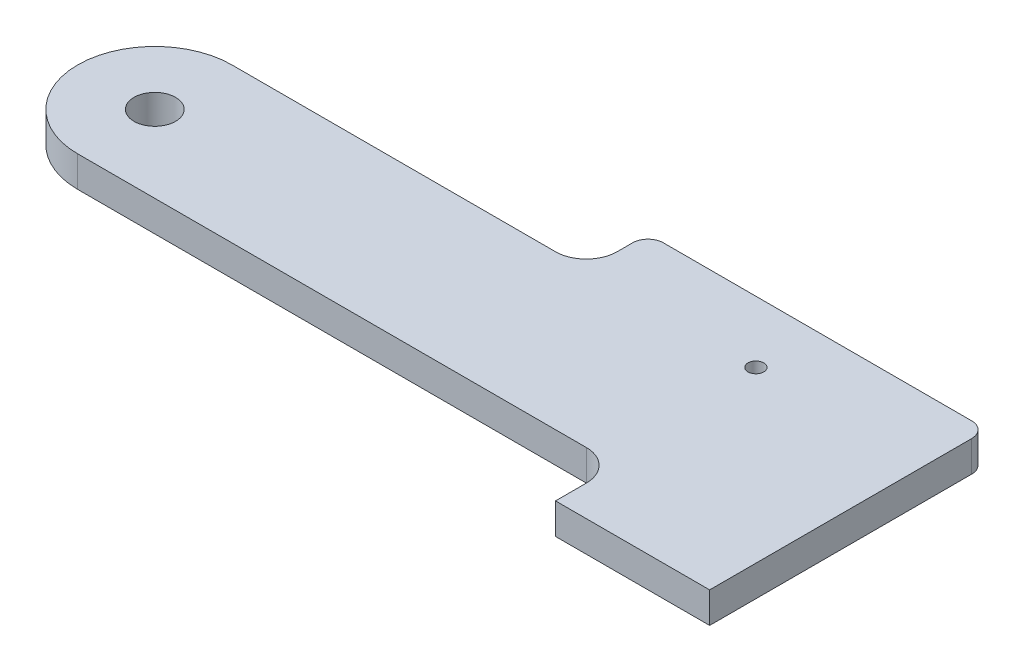
ISO-10303-21;
HEADER;
FILE_DESCRIPTION(('STEP AP214'),'2;1');
FILE_NAME('part.step','',(''),(''),'','','');
FILE_SCHEMA(('AUTOMOTIVE_DESIGN { 1 0 10303 214 1 1 1 1 }'));
ENDSEC;
DATA;
#1=APPLICATION_CONTEXT('core data for automotive mechanical design processes');
#2=APPLICATION_PROTOCOL_DEFINITION('international standard','automotive_design',2000,#1);
#3=PRODUCT_CONTEXT('',#1,'mechanical');
#4=PRODUCT('Part','Part','',(#3));
#5=PRODUCT_RELATED_PRODUCT_CATEGORY('part','',(#4));
#6=PRODUCT_DEFINITION_FORMATION('','',#4);
#7=PRODUCT_DEFINITION_CONTEXT('part definition',#1,'design');
#8=PRODUCT_DEFINITION('design','',#6,#7);
#9=PRODUCT_DEFINITION_SHAPE('','',#8);
#10=(LENGTH_UNIT() NAMED_UNIT(*) SI_UNIT(.MILLI.,.METRE.));
#11=(NAMED_UNIT(*) PLANE_ANGLE_UNIT() SI_UNIT($,.RADIAN.));
#12=(NAMED_UNIT(*) SI_UNIT($,.STERADIAN.) SOLID_ANGLE_UNIT());
#13=UNCERTAINTY_MEASURE_WITH_UNIT(LENGTH_MEASURE(1.E-05),#10,'distance_accuracy_value','');
#14=(GEOMETRIC_REPRESENTATION_CONTEXT(3) GLOBAL_UNCERTAINTY_ASSIGNED_CONTEXT((#13)) GLOBAL_UNIT_ASSIGNED_CONTEXT((#10,
#11,#12)) REPRESENTATION_CONTEXT('',''));
#15=CARTESIAN_POINT('',(0.,0.,0.));
#16=DIRECTION('',(0.,0.,1.));
#17=DIRECTION('',(1.,0.,0.));
#18=AXIS2_PLACEMENT_3D('',#15,#16,#17);
#19=CARTESIAN_POINT('',(-125.,10.,25.));
#20=DIRECTION('',(0.,0.,-1.));
#21=DIRECTION('',(-1.,0.,0.));
#22=AXIS2_PLACEMENT_3D('',#19,#20,#21);
#23=PLANE('',#22);
#24=DIRECTION('',(1.,0.,0.));
#25=VECTOR('',#24,1.);
#26=CARTESIAN_POINT('',(-125.,0.,25.));
#27=LINE('',#26,#25);
#28=CARTESIAN_POINT('',(-99.9999999999999,0.,25.));
#29=VERTEX_POINT('',#28);
#30=CARTESIAN_POINT('',(65.0000000000001,0.,25.));
#31=VERTEX_POINT('',#30);
#32=EDGE_CURVE('E132',#29,#31,#27,.T.);
#33=ORIENTED_EDGE('',*,*,#32,.T.);
#34=DIRECTION('',(0.,-1.,0.));
#35=VECTOR('',#34,1.);
#36=CARTESIAN_POINT('',(65.0000000000001,9.99999999999999,25.));
#37=LINE('',#36,#35);
#38=CARTESIAN_POINT('',(65.0000000000001,10.,25.));
#39=VERTEX_POINT('',#38);
#40=EDGE_CURVE('E207',#31,#39,#37,.F.);
#41=ORIENTED_EDGE('',*,*,#40,.T.);
#42=DIRECTION('',(1.,0.,0.));
#43=VECTOR('',#42,1.);
#44=CARTESIAN_POINT('',(-125.,10.,25.));
#45=LINE('',#44,#43);
#46=CARTESIAN_POINT('',(-99.9999999999999,10.,25.));
#47=VERTEX_POINT('',#46);
#48=EDGE_CURVE('E178',#47,#39,#45,.T.);
#49=ORIENTED_EDGE('',*,*,#48,.F.);
#50=DIRECTION('',(0.,-1.,0.));
#51=VECTOR('',#50,1.);
#52=CARTESIAN_POINT('',(-99.9999999999999,10.,25.));
#53=LINE('',#52,#51);
#54=EDGE_CURVE('E181',#47,#29,#53,.T.);
#55=ORIENTED_EDGE('',*,*,#54,.T.);
#56=EDGE_LOOP('',(#33,#41,#49,#55));
#57=FACE_BOUND('',#56,.T.);
#58=ADVANCED_FACE('F32',(#57),#23,.F.);
#59=CARTESIAN_POINT('',(-125.,10.,-25.));
#60=DIRECTION('',(0.,0.,1.));
#61=DIRECTION('',(1.,0.,0.));
#62=AXIS2_PLACEMENT_3D('',#59,#60,#61);
#63=PLANE('',#62);
#64=DIRECTION('',(-1.,0.,0.));
#65=VECTOR('',#64,1.);
#66=CARTESIAN_POINT('',(-125.,10.,-25.));
#67=LINE('',#66,#65);
#68=CARTESIAN_POINT('',(5.00000000000009,10.,-25.));
#69=VERTEX_POINT('',#68);
#70=CARTESIAN_POINT('',(-99.9999999999999,10.,-25.));
#71=VERTEX_POINT('',#70);
#72=EDGE_CURVE('E131',#69,#71,#67,.T.);
#73=ORIENTED_EDGE('',*,*,#72,.F.);
#74=DIRECTION('',(0.,1.,0.));
#75=VECTOR('',#74,1.);
#76=CARTESIAN_POINT('',(5.00000000000008,0.,-25.));
#77=LINE('',#76,#75);
#78=CARTESIAN_POINT('',(5.00000000000009,0.,-25.));
#79=VERTEX_POINT('',#78);
#80=EDGE_CURVE('E212',#69,#79,#77,.F.);
#81=ORIENTED_EDGE('',*,*,#80,.T.);
#82=DIRECTION('',(-1.,0.,0.));
#83=VECTOR('',#82,1.);
#84=CARTESIAN_POINT('',(-125.,0.,-25.));
#85=LINE('',#84,#83);
#86=CARTESIAN_POINT('',(-99.9999999999999,0.,-25.));
#87=VERTEX_POINT('',#86);
#88=EDGE_CURVE('E184',#79,#87,#85,.T.);
#89=ORIENTED_EDGE('',*,*,#88,.T.);
#90=DIRECTION('',(0.,-1.,0.));
#91=VECTOR('',#90,1.);
#92=CARTESIAN_POINT('',(-99.9999999999999,10.,-25.));
#93=LINE('',#92,#91);
#94=EDGE_CURVE('E199',#87,#71,#93,.F.);
#95=ORIENTED_EDGE('',*,*,#94,.T.);
#96=EDGE_LOOP('',(#73,#81,#89,#95));
#97=FACE_BOUND('',#96,.T.);
#98=ADVANCED_FACE('F258',(#97),#63,.F.);
#99=CARTESIAN_POINT('',(125.,10.,25.));
#100=DIRECTION('',(-1.,0.,0.));
#101=DIRECTION('',(0.,0.,1.));
#102=AXIS2_PLACEMENT_3D('',#99,#100,#101);
#103=PLANE('',#102);
#104=DIRECTION('',(0.,0.,-1.));
#105=VECTOR('',#104,1.);
#106=CARTESIAN_POINT('',(125.,0.,25.));
#107=LINE('',#106,#105);
#108=CARTESIAN_POINT('',(125.,0.,45.));
#109=VERTEX_POINT('',#108);
#110=CARTESIAN_POINT('',(125.,0.,-40.));
#111=VERTEX_POINT('',#110);
#112=EDGE_CURVE('E182',#109,#111,#107,.T.);
#113=ORIENTED_EDGE('',*,*,#112,.T.);
#114=DIRECTION('',(0.,-1.,0.));
#115=VECTOR('',#114,1.);
#116=CARTESIAN_POINT('',(125.,10.,-40.));
#117=LINE('',#116,#115);
#118=CARTESIAN_POINT('',(125.,10.,-40.));
#119=VERTEX_POINT('',#118);
#120=EDGE_CURVE('E55',#111,#119,#117,.F.);
#121=ORIENTED_EDGE('',*,*,#120,.T.);
#122=DIRECTION('',(0.,0.,-1.));
#123=VECTOR('',#122,1.);
#124=CARTESIAN_POINT('',(125.,10.,25.));
#125=LINE('',#124,#123);
#126=CARTESIAN_POINT('',(125.,10.,45.));
#127=VERTEX_POINT('',#126);
#128=EDGE_CURVE('E125',#127,#119,#125,.T.);
#129=ORIENTED_EDGE('',*,*,#128,.F.);
#130=DIRECTION('',(0.,1.,0.));
#131=VECTOR('',#130,1.);
#132=CARTESIAN_POINT('',(125.,0.,45.));
#133=LINE('',#132,#131);
#134=EDGE_CURVE('E129',#109,#127,#133,.T.);
#135=ORIENTED_EDGE('',*,*,#134,.F.);
#136=EDGE_LOOP('',(#113,#121,#129,#135));
#137=FACE_BOUND('',#136,.T.);
#138=ADVANCED_FACE('F127',(#137),#103,.F.);
#139=CARTESIAN_POINT('',(0.,10.,0.));
#140=DIRECTION('',(0.,-1.,0.));
#141=DIRECTION('',(0.,0.,-1.));
#142=AXIS2_PLACEMENT_3D('',#139,#140,#141);
#143=PLANE('',#142);
#144=CARTESIAN_POINT('',(70.0000000000001,10.,-25.));
#145=DIRECTION('',(0.,-1.,0.));
#146=DIRECTION('',(0.,0.,-1.));
#147=AXIS2_PLACEMENT_3D('',#144,#145,#146);
#148=CIRCLE('',#147,2.5527);
#149=CARTESIAN_POINT('',(70.0000000000001,10.,-27.5527));
#150=VERTEX_POINT('',#149);
#151=EDGE_CURVE('E147',#150,#150,#148,.T.);
#152=ORIENTED_EDGE('',*,*,#151,.T.);
#153=EDGE_LOOP('',(#152));
#154=FACE_BOUND('',#153,.T.);
#155=CARTESIAN_POINT('',(-99.9999999999999,10.,0.));
#156=DIRECTION('',(0.,1.,0.));
#157=DIRECTION('',(0.,0.,1.));
#158=AXIS2_PLACEMENT_3D('',#155,#156,#157);
#159=CIRCLE('',#158,6.75);
#160=CARTESIAN_POINT('',(-99.9999999999999,10.,6.75000000000002));
#161=VERTEX_POINT('',#160);
#162=EDGE_CURVE('E170',#161,#161,#159,.T.);
#163=ORIENTED_EDGE('',*,*,#162,.F.);
#164=EDGE_LOOP('',(#163));
#165=FACE_BOUND('',#164,.T.);
#166=ORIENTED_EDGE('',*,*,#128,.T.);
#167=CARTESIAN_POINT('',(120.,10.,-40.));
#168=DIRECTION('',(0.,-1.,0.));
#169=DIRECTION('',(0.,0.,-1.));
#170=AXIS2_PLACEMENT_3D('',#167,#168,#169);
#171=CIRCLE('',#170,5.);
#172=CARTESIAN_POINT('',(120.,10.,-45.));
#173=VERTEX_POINT('',#172);
#174=EDGE_CURVE('E40',#119,#173,#171,.F.);
#175=ORIENTED_EDGE('',*,*,#174,.T.);
#176=DIRECTION('',(1.,0.,0.));
#177=VECTOR('',#176,1.);
#178=CARTESIAN_POINT('',(125.,10.,-45.));
#179=LINE('',#178,#177);
#180=CARTESIAN_POINT('',(20.0000000000001,10.,-45.));
#181=VERTEX_POINT('',#180);
#182=EDGE_CURVE('E163',#181,#173,#179,.T.);
#183=ORIENTED_EDGE('',*,*,#182,.F.);
#184=CARTESIAN_POINT('',(20.0000000000001,10.,-40.));
#185=DIRECTION('',(0.,-1.,0.));
#186=DIRECTION('',(0.,0.,-1.));
#187=AXIS2_PLACEMENT_3D('',#184,#185,#186);
#188=CIRCLE('',#187,5.);
#189=CARTESIAN_POINT('',(15.0000000000001,10.,-40.));
#190=VERTEX_POINT('',#189);
#191=EDGE_CURVE('E47',#181,#190,#188,.F.);
#192=ORIENTED_EDGE('',*,*,#191,.T.);
#193=DIRECTION('',(0.,0.,1.));
#194=VECTOR('',#193,1.);
#195=CARTESIAN_POINT('',(15.0000000000001,10.,-45.));
#196=LINE('',#195,#194);
#197=CARTESIAN_POINT('',(15.0000000000001,10.,-35.));
#198=VERTEX_POINT('',#197);
#199=EDGE_CURVE('E166',#190,#198,#196,.T.);
#200=ORIENTED_EDGE('',*,*,#199,.T.);
#201=CARTESIAN_POINT('',(5.00000000000008,10.,-35.));
#202=DIRECTION('',(0.,-1.,0.));
#203=DIRECTION('',(0.,0.,-1.));
#204=AXIS2_PLACEMENT_3D('',#201,#202,#203);
#205=CIRCLE('',#204,10.);
#206=EDGE_CURVE('E218',#198,#69,#205,.T.);
#207=ORIENTED_EDGE('',*,*,#206,.T.);
#208=ORIENTED_EDGE('',*,*,#72,.T.);
#209=CARTESIAN_POINT('',(-99.9999999999999,10.,0.));
#210=DIRECTION('',(0.,-1.,0.));
#211=DIRECTION('',(0.,0.,-1.));
#212=AXIS2_PLACEMENT_3D('',#209,#210,#211);
#213=CIRCLE('',#212,25.);
#214=CARTESIAN_POINT('',(-125.,10.,0.));
#215=VERTEX_POINT('',#214);
#216=EDGE_CURVE('E195',#71,#215,#213,.F.);
#217=ORIENTED_EDGE('',*,*,#216,.T.);
#218=CARTESIAN_POINT('',(-99.9999999999999,10.,0.));
#219=DIRECTION('',(0.,-1.,0.));
#220=DIRECTION('',(0.,0.,-1.));
#221=AXIS2_PLACEMENT_3D('',#218,#219,#220);
#222=CIRCLE('',#221,25.);
#223=EDGE_CURVE('E197',#215,#47,#222,.F.);
#224=ORIENTED_EDGE('',*,*,#223,.T.);
#225=ORIENTED_EDGE('',*,*,#48,.T.);
#226=CARTESIAN_POINT('',(65.0000000000001,10.,35.));
#227=DIRECTION('',(0.,-1.,0.));
#228=DIRECTION('',(0.,0.,-1.));
#229=AXIS2_PLACEMENT_3D('',#226,#227,#228);
#230=CIRCLE('',#229,10.);
#231=CARTESIAN_POINT('',(75.0000000000001,10.,35.));
#232=VERTEX_POINT('',#231);
#233=EDGE_CURVE('E216',#39,#232,#230,.T.);
#234=ORIENTED_EDGE('',*,*,#233,.T.);
#235=DIRECTION('',(0.,0.,-1.));
#236=VECTOR('',#235,1.);
#237=CARTESIAN_POINT('',(75.0000000000001,10.,45.));
#238=LINE('',#237,#236);
#239=CARTESIAN_POINT('',(75.0000000000001,10.,45.));
#240=VERTEX_POINT('',#239);
#241=EDGE_CURVE('E138',#240,#232,#238,.T.);
#242=ORIENTED_EDGE('',*,*,#241,.F.);
#243=DIRECTION('',(-1.,0.,0.));
#244=VECTOR('',#243,1.);
#245=CARTESIAN_POINT('',(125.,10.,45.));
#246=LINE('',#245,#244);
#247=EDGE_CURVE('E135',#127,#240,#246,.T.);
#248=ORIENTED_EDGE('',*,*,#247,.F.);
#249=EDGE_LOOP('',(#166,#175,#183,#192,#200,#207,#208,#217,#224,#225,#234,#242,#248));
#250=FACE_BOUND('',#249,.T.);
#251=ADVANCED_FACE('F136',(#154,#165,#250),#143,.F.);
#252=CARTESIAN_POINT('',(0.,0.,0.));
#253=DIRECTION('',(0.,-1.,0.));
#254=DIRECTION('',(0.,0.,-1.));
#255=AXIS2_PLACEMENT_3D('',#252,#253,#254);
#256=PLANE('',#255);
#257=CARTESIAN_POINT('',(70.0000000000001,0.,-25.));
#258=DIRECTION('',(0.,-1.,0.));
#259=DIRECTION('',(0.,0.,-1.));
#260=AXIS2_PLACEMENT_3D('',#257,#258,#259);
#261=CIRCLE('',#260,2.5527);
#262=CARTESIAN_POINT('',(70.0000000000001,0.,-27.5527));
#263=VERTEX_POINT('',#262);
#264=EDGE_CURVE('E150',#263,#263,#261,.T.);
#265=ORIENTED_EDGE('',*,*,#264,.F.);
#266=EDGE_LOOP('',(#265));
#267=FACE_BOUND('',#266,.T.);
#268=CARTESIAN_POINT('',(-99.9999999999999,0.,0.));
#269=DIRECTION('',(0.,1.,0.));
#270=DIRECTION('',(0.,0.,1.));
#271=AXIS2_PLACEMENT_3D('',#268,#269,#270);
#272=CIRCLE('',#271,6.75);
#273=CARTESIAN_POINT('',(-99.9999999999999,0.,6.75000000000002));
#274=VERTEX_POINT('',#273);
#275=EDGE_CURVE('E171',#274,#274,#272,.T.);
#276=ORIENTED_EDGE('',*,*,#275,.T.);
#277=EDGE_LOOP('',(#276));
#278=FACE_BOUND('',#277,.T.);
#279=DIRECTION('',(-1.,0.,0.));
#280=VECTOR('',#279,1.);
#281=CARTESIAN_POINT('',(125.,0.,-45.));
#282=LINE('',#281,#280);
#283=CARTESIAN_POINT('',(120.,0.,-45.));
#284=VERTEX_POINT('',#283);
#285=CARTESIAN_POINT('',(20.0000000000001,0.,-45.));
#286=VERTEX_POINT('',#285);
#287=EDGE_CURVE('E160',#284,#286,#282,.T.);
#288=ORIENTED_EDGE('',*,*,#287,.F.);
#289=CARTESIAN_POINT('',(120.,0.,-40.));
#290=DIRECTION('',(0.,-1.,0.));
#291=DIRECTION('',(0.,0.,-1.));
#292=AXIS2_PLACEMENT_3D('',#289,#290,#291);
#293=CIRCLE('',#292,5.);
#294=EDGE_CURVE('E231',#284,#111,#293,.T.);
#295=ORIENTED_EDGE('',*,*,#294,.T.);
#296=ORIENTED_EDGE('',*,*,#112,.F.);
#297=DIRECTION('',(1.,0.,0.));
#298=VECTOR('',#297,1.);
#299=CARTESIAN_POINT('',(125.,0.,45.));
#300=LINE('',#299,#298);
#301=CARTESIAN_POINT('',(75.0000000000001,0.,45.));
#302=VERTEX_POINT('',#301);
#303=EDGE_CURVE('E146',#302,#109,#300,.T.);
#304=ORIENTED_EDGE('',*,*,#303,.F.);
#305=DIRECTION('',(0.,0.,-1.));
#306=VECTOR('',#305,1.);
#307=CARTESIAN_POINT('',(75.0000000000001,0.,45.));
#308=LINE('',#307,#306);
#309=CARTESIAN_POINT('',(75.0000000000001,0.,35.));
#310=VERTEX_POINT('',#309);
#311=EDGE_CURVE('E156',#302,#310,#308,.T.);
#312=ORIENTED_EDGE('',*,*,#311,.T.);
#313=CARTESIAN_POINT('',(65.0000000000001,0.,35.));
#314=DIRECTION('',(0.,-1.,0.));
#315=DIRECTION('',(0.,0.,-1.));
#316=AXIS2_PLACEMENT_3D('',#313,#314,#315);
#317=CIRCLE('',#316,10.);
#318=EDGE_CURVE('E214',#310,#31,#317,.F.);
#319=ORIENTED_EDGE('',*,*,#318,.T.);
#320=ORIENTED_EDGE('',*,*,#32,.F.);
#321=CARTESIAN_POINT('',(-99.9999999999999,0.,0.));
#322=DIRECTION('',(0.,-1.,0.));
#323=DIRECTION('',(0.,0.,-1.));
#324=AXIS2_PLACEMENT_3D('',#321,#322,#323);
#325=CIRCLE('',#324,25.);
#326=CARTESIAN_POINT('',(-125.,0.,0.));
#327=VERTEX_POINT('',#326);
#328=EDGE_CURVE('E193',#29,#327,#325,.T.);
#329=ORIENTED_EDGE('',*,*,#328,.T.);
#330=CARTESIAN_POINT('',(-99.9999999999999,0.,0.));
#331=DIRECTION('',(0.,-1.,0.));
#332=DIRECTION('',(0.,0.,-1.));
#333=AXIS2_PLACEMENT_3D('',#330,#331,#332);
#334=CIRCLE('',#333,25.);
#335=EDGE_CURVE('E190',#327,#87,#334,.T.);
#336=ORIENTED_EDGE('',*,*,#335,.T.);
#337=ORIENTED_EDGE('',*,*,#88,.F.);
#338=CARTESIAN_POINT('',(5.00000000000008,0.,-35.));
#339=DIRECTION('',(0.,-1.,0.));
#340=DIRECTION('',(0.,0.,-1.));
#341=AXIS2_PLACEMENT_3D('',#338,#339,#340);
#342=CIRCLE('',#341,10.);
#343=CARTESIAN_POINT('',(15.0000000000001,0.,-35.));
#344=VERTEX_POINT('',#343);
#345=EDGE_CURVE('E220',#79,#344,#342,.F.);
#346=ORIENTED_EDGE('',*,*,#345,.T.);
#347=DIRECTION('',(0.,0.,1.));
#348=VECTOR('',#347,1.);
#349=CARTESIAN_POINT('',(15.0000000000001,0.,-45.));
#350=LINE('',#349,#348);
#351=CARTESIAN_POINT('',(15.0000000000001,0.,-40.));
#352=VERTEX_POINT('',#351);
#353=EDGE_CURVE('E168',#352,#344,#350,.T.);
#354=ORIENTED_EDGE('',*,*,#353,.F.);
#355=CARTESIAN_POINT('',(20.0000000000001,0.,-40.));
#356=DIRECTION('',(0.,-1.,0.));
#357=DIRECTION('',(0.,0.,-1.));
#358=AXIS2_PLACEMENT_3D('',#355,#356,#357);
#359=CIRCLE('',#358,5.);
#360=EDGE_CURVE('E229',#352,#286,#359,.T.);
#361=ORIENTED_EDGE('',*,*,#360,.T.);
#362=EDGE_LOOP('',(#288,#295,#296,#304,#312,#319,#320,#329,#336,#337,#346,#354,#361));
#363=FACE_BOUND('',#362,.T.);
#364=ADVANCED_FACE('F242',(#267,#278,#363),#256,.T.);
#365=CARTESIAN_POINT('',(-99.9999999999999,10.,0.));
#366=DIRECTION('',(0.,-1.,0.));
#367=DIRECTION('',(0.,0.,-1.));
#368=AXIS2_PLACEMENT_3D('',#365,#366,#367);
#369=CYLINDRICAL_SURFACE('',#368,25.);
#370=DIRECTION('',(0.,-1.,0.));
#371=VECTOR('',#370,1.);
#372=CARTESIAN_POINT('',(-125.,10.,0.));
#373=LINE('',#372,#371);
#374=EDGE_CURVE('E174',#215,#327,#373,.T.);
#375=ORIENTED_EDGE('',*,*,#374,.F.);
#376=ORIENTED_EDGE('',*,*,#216,.F.);
#377=ORIENTED_EDGE('',*,*,#94,.F.);
#378=ORIENTED_EDGE('',*,*,#335,.F.);
#379=EDGE_LOOP('',(#375,#376,#377,#378));
#380=FACE_BOUND('',#379,.T.);
#381=ADVANCED_FACE('F264',(#380),#369,.T.);
#382=CARTESIAN_POINT('',(-99.9999999999999,10.,0.));
#383=DIRECTION('',(0.,-1.,0.));
#384=DIRECTION('',(0.,0.,-1.));
#385=AXIS2_PLACEMENT_3D('',#382,#383,#384);
#386=CYLINDRICAL_SURFACE('',#385,25.);
#387=ORIENTED_EDGE('',*,*,#223,.F.);
#388=ORIENTED_EDGE('',*,*,#374,.T.);
#389=ORIENTED_EDGE('',*,*,#328,.F.);
#390=ORIENTED_EDGE('',*,*,#54,.F.);
#391=EDGE_LOOP('',(#387,#388,#389,#390));
#392=FACE_BOUND('',#391,.T.);
#393=ADVANCED_FACE('F273',(#392),#386,.T.);
#394=CARTESIAN_POINT('',(-99.9999999999999,0.,0.));
#395=DIRECTION('',(0.,1.,0.));
#396=DIRECTION('',(0.,0.,1.));
#397=AXIS2_PLACEMENT_3D('',#394,#395,#396);
#398=CYLINDRICAL_SURFACE('',#397,6.75);
#399=ORIENTED_EDGE('',*,*,#275,.F.);
#400=EDGE_LOOP('',(#399));
#401=FACE_BOUND('',#400,.T.);
#402=ORIENTED_EDGE('',*,*,#162,.T.);
#403=EDGE_LOOP('',(#402));
#404=FACE_BOUND('',#403,.T.);
#405=ADVANCED_FACE('F301',(#401,#404),#398,.F.);
#406=CARTESIAN_POINT('',(15.0000000000001,0.,-45.));
#407=DIRECTION('',(1.,0.,0.));
#408=DIRECTION('',(0.,0.,-1.));
#409=AXIS2_PLACEMENT_3D('',#406,#407,#408);
#410=PLANE('',#409);
#411=ORIENTED_EDGE('',*,*,#199,.F.);
#412=DIRECTION('',(0.,1.,0.));
#413=VECTOR('',#412,1.);
#414=CARTESIAN_POINT('',(15.0000000000001,0.,-40.));
#415=LINE('',#414,#413);
#416=EDGE_CURVE('E11',#190,#352,#415,.F.);
#417=ORIENTED_EDGE('',*,*,#416,.T.);
#418=ORIENTED_EDGE('',*,*,#353,.T.);
#419=DIRECTION('',(0.,1.,0.));
#420=VECTOR('',#419,1.);
#421=CARTESIAN_POINT('',(15.0000000000001,10.,-35.));
#422=LINE('',#421,#420);
#423=EDGE_CURVE('E209',#344,#198,#422,.T.);
#424=ORIENTED_EDGE('',*,*,#423,.T.);
#425=EDGE_LOOP('',(#411,#417,#418,#424));
#426=FACE_BOUND('',#425,.T.);
#427=ADVANCED_FACE('F248',(#426),#410,.F.);
#428=CARTESIAN_POINT('',(0.,0.,-45.));
#429=DIRECTION('',(0.,0.,1.));
#430=DIRECTION('',(1.,0.,0.));
#431=AXIS2_PLACEMENT_3D('',#428,#429,#430);
#432=PLANE('',#431);
#433=ORIENTED_EDGE('',*,*,#182,.T.);
#434=DIRECTION('',(0.,-1.,0.));
#435=VECTOR('',#434,1.);
#436=CARTESIAN_POINT('',(120.,0.,-45.));
#437=LINE('',#436,#435);
#438=EDGE_CURVE('E226',#173,#284,#437,.T.);
#439=ORIENTED_EDGE('',*,*,#438,.T.);
#440=ORIENTED_EDGE('',*,*,#287,.T.);
#441=DIRECTION('',(0.,1.,0.));
#442=VECTOR('',#441,1.);
#443=CARTESIAN_POINT('',(20.0000000000001,0.,-45.));
#444=LINE('',#443,#442);
#445=EDGE_CURVE('E223',#286,#181,#444,.T.);
#446=ORIENTED_EDGE('',*,*,#445,.T.);
#447=EDGE_LOOP('',(#433,#439,#440,#446));
#448=FACE_BOUND('',#447,.T.);
#449=ADVANCED_FACE('F237',(#448),#432,.F.);
#450=CARTESIAN_POINT('',(75.0000000000001,0.,45.));
#451=DIRECTION('',(1.,0.,0.));
#452=DIRECTION('',(0.,1.,0.));
#453=AXIS2_PLACEMENT_3D('',#450,#451,#452);
#454=PLANE('',#453);
#455=ORIENTED_EDGE('',*,*,#241,.T.);
#456=DIRECTION('',(0.,-1.,0.));
#457=VECTOR('',#456,1.);
#458=CARTESIAN_POINT('',(75.0000000000001,0.,35.));
#459=LINE('',#458,#457);
#460=EDGE_CURVE('E202',#232,#310,#459,.T.);
#461=ORIENTED_EDGE('',*,*,#460,.T.);
#462=ORIENTED_EDGE('',*,*,#311,.F.);
#463=DIRECTION('',(0.,-1.,0.));
#464=VECTOR('',#463,1.);
#465=CARTESIAN_POINT('',(75.0000000000001,0.,45.));
#466=LINE('',#465,#464);
#467=EDGE_CURVE('E141',#240,#302,#466,.T.);
#468=ORIENTED_EDGE('',*,*,#467,.F.);
#469=EDGE_LOOP('',(#455,#461,#462,#468));
#470=FACE_BOUND('',#469,.T.);
#471=ADVANCED_FACE('F278',(#470),#454,.F.);
#472=CARTESIAN_POINT('',(0.,0.,45.));
#473=DIRECTION('',(0.,0.,1.));
#474=DIRECTION('',(1.,0.,0.));
#475=AXIS2_PLACEMENT_3D('',#472,#473,#474);
#476=PLANE('',#475);
#477=ORIENTED_EDGE('',*,*,#134,.T.);
#478=ORIENTED_EDGE('',*,*,#247,.T.);
#479=ORIENTED_EDGE('',*,*,#467,.T.);
#480=ORIENTED_EDGE('',*,*,#303,.T.);
#481=EDGE_LOOP('',(#477,#478,#479,#480));
#482=FACE_BOUND('',#481,.T.);
#483=ADVANCED_FACE('F144',(#482),#476,.T.);
#484=CARTESIAN_POINT('',(65.0000000000001,0.,35.));
#485=DIRECTION('',(0.,1.,0.));
#486=DIRECTION('',(-1.,0.,0.));
#487=AXIS2_PLACEMENT_3D('',#484,#485,#486);
#488=CYLINDRICAL_SURFACE('',#487,10.);
#489=ORIENTED_EDGE('',*,*,#233,.F.);
#490=ORIENTED_EDGE('',*,*,#40,.F.);
#491=ORIENTED_EDGE('',*,*,#318,.F.);
#492=ORIENTED_EDGE('',*,*,#460,.F.);
#493=EDGE_LOOP('',(#489,#490,#491,#492));
#494=FACE_BOUND('',#493,.T.);
#495=ADVANCED_FACE('F275',(#494),#488,.F.);
#496=CARTESIAN_POINT('',(5.00000000000008,0.,-35.));
#497=DIRECTION('',(0.,-1.,0.));
#498=DIRECTION('',(0.,0.,-1.));
#499=AXIS2_PLACEMENT_3D('',#496,#497,#498);
#500=CYLINDRICAL_SURFACE('',#499,10.);
#501=ORIENTED_EDGE('',*,*,#345,.F.);
#502=ORIENTED_EDGE('',*,*,#80,.F.);
#503=ORIENTED_EDGE('',*,*,#206,.F.);
#504=ORIENTED_EDGE('',*,*,#423,.F.);
#505=EDGE_LOOP('',(#501,#502,#503,#504));
#506=FACE_BOUND('',#505,.T.);
#507=ADVANCED_FACE('F255',(#506),#500,.F.);
#508=CARTESIAN_POINT('',(120.,0.,-40.));
#509=DIRECTION('',(0.,-1.,0.));
#510=DIRECTION('',(0.,0.,-1.));
#511=AXIS2_PLACEMENT_3D('',#508,#509,#510);
#512=CYLINDRICAL_SURFACE('',#511,5.);
#513=ORIENTED_EDGE('',*,*,#174,.F.);
#514=ORIENTED_EDGE('',*,*,#120,.F.);
#515=ORIENTED_EDGE('',*,*,#294,.F.);
#516=ORIENTED_EDGE('',*,*,#438,.F.);
#517=EDGE_LOOP('',(#513,#514,#515,#516));
#518=FACE_BOUND('',#517,.T.);
#519=ADVANCED_FACE('F240',(#518),#512,.T.);
#520=CARTESIAN_POINT('',(20.0000000000001,0.,-40.));
#521=DIRECTION('',(0.,1.,0.));
#522=DIRECTION('',(0.,0.,1.));
#523=AXIS2_PLACEMENT_3D('',#520,#521,#522);
#524=CYLINDRICAL_SURFACE('',#523,5.);
#525=ORIENTED_EDGE('',*,*,#360,.F.);
#526=ORIENTED_EDGE('',*,*,#416,.F.);
#527=ORIENTED_EDGE('',*,*,#191,.F.);
#528=ORIENTED_EDGE('',*,*,#445,.F.);
#529=EDGE_LOOP('',(#525,#526,#527,#528));
#530=FACE_BOUND('',#529,.T.);
#531=ADVANCED_FACE('F34',(#530),#524,.T.);
#532=CARTESIAN_POINT('',(70.0000000000001,10.,-25.));
#533=DIRECTION('',(0.,-1.,0.));
#534=DIRECTION('',(0.,0.,-1.));
#535=AXIS2_PLACEMENT_3D('',#532,#533,#534);
#536=CYLINDRICAL_SURFACE('',#535,2.5527);
#537=ORIENTED_EDGE('',*,*,#151,.F.);
#538=EDGE_LOOP('',(#537));
#539=FACE_BOUND('',#538,.T.);
#540=ORIENTED_EDGE('',*,*,#264,.T.);
#541=EDGE_LOOP('',(#540));
#542=FACE_BOUND('',#541,.T.);
#543=ADVANCED_FACE('F311',(#539,#542),#536,.F.);
#544=CLOSED_SHELL('',(#58,#98,#138,#251,#364,#381,#393,#405,#427,#449,#471,#483,#495,#507,#519,
#531,#543));
#545=MANIFOLD_SOLID_BREP('B2',#544);
#546=ADVANCED_BREP_SHAPE_REPRESENTATION('',(#18,#545),#14);
#547=SHAPE_DEFINITION_REPRESENTATION(#9,#546);
ENDSEC;
END-ISO-10303-21;
